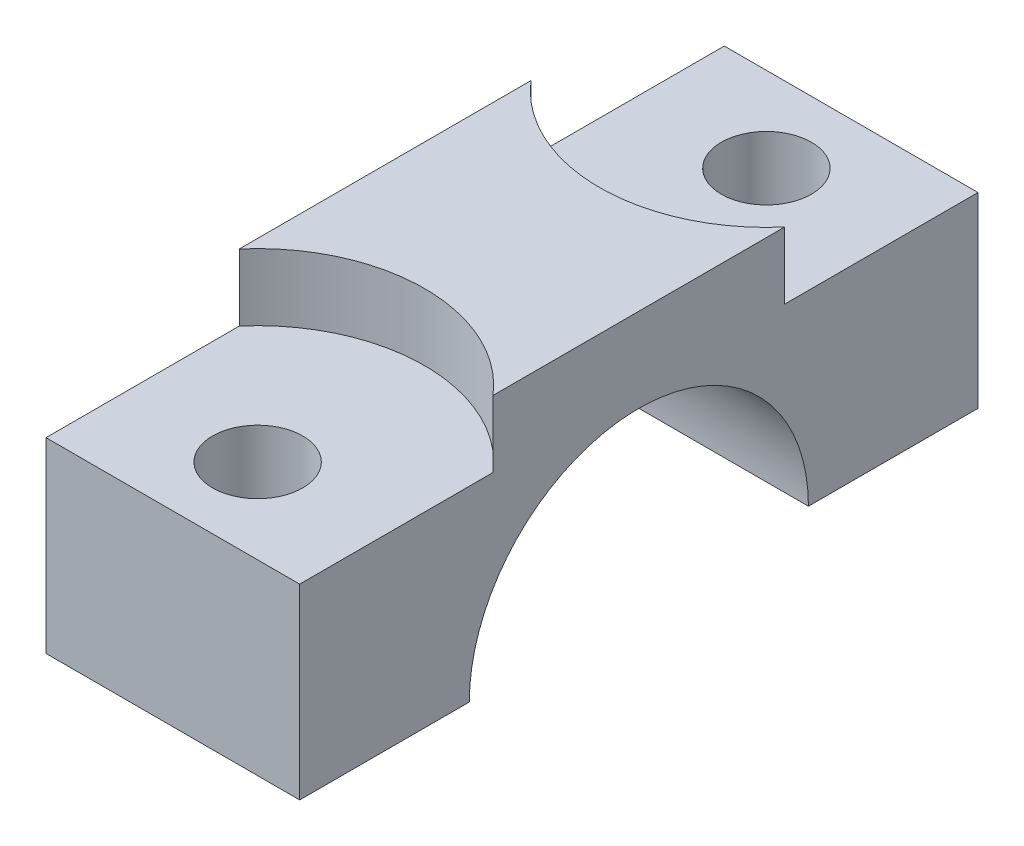
ISO-10303-21;
HEADER;
FILE_DESCRIPTION(('STEP AP214'),'2;1');
FILE_NAME('part.step','',(''),(''),'','','');
FILE_SCHEMA(('AUTOMOTIVE_DESIGN { 1 0 10303 214 1 1 1 1 }'));
ENDSEC;
DATA;
#1=APPLICATION_CONTEXT('core data for automotive mechanical design processes');
#2=APPLICATION_PROTOCOL_DEFINITION('international standard','automotive_design',2000,#1);
#3=PRODUCT_CONTEXT('',#1,'mechanical');
#4=PRODUCT('Part','Part','',(#3));
#5=PRODUCT_RELATED_PRODUCT_CATEGORY('part','',(#4));
#6=PRODUCT_DEFINITION_FORMATION('','',#4);
#7=PRODUCT_DEFINITION_CONTEXT('part definition',#1,'design');
#8=PRODUCT_DEFINITION('design','',#6,#7);
#9=PRODUCT_DEFINITION_SHAPE('','',#8);
#10=(LENGTH_UNIT() NAMED_UNIT(*) SI_UNIT(.MILLI.,.METRE.));
#11=(NAMED_UNIT(*) PLANE_ANGLE_UNIT() SI_UNIT($,.RADIAN.));
#12=(NAMED_UNIT(*) SI_UNIT($,.STERADIAN.) SOLID_ANGLE_UNIT());
#13=UNCERTAINTY_MEASURE_WITH_UNIT(LENGTH_MEASURE(1.E-05),#10,'distance_accuracy_value','');
#14=(GEOMETRIC_REPRESENTATION_CONTEXT(3) GLOBAL_UNCERTAINTY_ASSIGNED_CONTEXT((#13)) GLOBAL_UNIT_ASSIGNED_CONTEXT((#10,
#11,#12)) REPRESENTATION_CONTEXT('',''));
#15=CARTESIAN_POINT('',(0.,0.,0.));
#16=DIRECTION('',(0.,0.,1.));
#17=DIRECTION('',(1.,0.,0.));
#18=AXIS2_PLACEMENT_3D('',#15,#16,#17);
#19=CARTESIAN_POINT('',(4.93506,4.5126142470934,0.));
#20=DIRECTION('',(-1.,0.,0.));
#21=DIRECTION('',(0.,0.,1.));
#22=AXIS2_PLACEMENT_3D('',#19,#20,#21);
#23=CYLINDRICAL_SURFACE('',#22,6.597396);
#24=CARTESIAN_POINT('',(-4.93506,4.5126142470934,0.));
#25=DIRECTION('',(1.,0.,0.));
#26=DIRECTION('',(0.,0.,-1.));
#27=AXIS2_PLACEMENT_3D('',#24,#25,#26);
#28=CIRCLE('',#27,6.597396);
#29=CARTESIAN_POINT('',(-4.93506,4.5126142470934,-6.597396));
#30=VERTEX_POINT('',#29);
#31=CARTESIAN_POINT('',(-4.93506,4.5126142470934,6.597396));
#32=VERTEX_POINT('',#31);
#33=EDGE_CURVE('E152',#30,#32,#28,.T.);
#34=ORIENTED_EDGE('',*,*,#33,.F.);
#35=DIRECTION('',(-1.,0.,0.));
#36=VECTOR('',#35,1.);
#37=CARTESIAN_POINT('',(4.93506,4.5126142470934,-6.597396));
#38=LINE('',#37,#36);
#39=CARTESIAN_POINT('',(4.93506,4.5126142470934,-6.597396));
#40=VERTEX_POINT('',#39);
#41=EDGE_CURVE('E182',#40,#30,#38,.T.);
#42=ORIENTED_EDGE('',*,*,#41,.F.);
#43=CARTESIAN_POINT('',(4.93506,4.5126142470934,0.));
#44=DIRECTION('',(1.,0.,0.));
#45=DIRECTION('',(0.,0.,-1.));
#46=AXIS2_PLACEMENT_3D('',#43,#44,#45);
#47=CIRCLE('',#46,6.597396);
#48=CARTESIAN_POINT('',(4.93506,4.5126142470934,6.597396));
#49=VERTEX_POINT('',#48);
#50=EDGE_CURVE('E226',#40,#49,#47,.T.);
#51=ORIENTED_EDGE('',*,*,#50,.T.);
#52=DIRECTION('',(-1.,0.,0.));
#53=VECTOR('',#52,1.);
#54=CARTESIAN_POINT('',(4.93506,4.5126142470934,6.597396));
#55=LINE('',#54,#53);
#56=EDGE_CURVE('E172',#49,#32,#55,.T.);
#57=ORIENTED_EDGE('',*,*,#56,.T.);
#58=EDGE_LOOP('',(#34,#42,#51,#57));
#59=FACE_BOUND('',#58,.T.);
#60=ADVANCED_FACE('F40',(#59),#23,.F.);
#61=CARTESIAN_POINT('',(4.93506,4.5126142470934,0.));
#62=DIRECTION('',(0.,1.,0.));
#63=DIRECTION('',(0.,0.,1.));
#64=AXIS2_PLACEMENT_3D('',#61,#62,#63);
#65=PLANE('',#64);
#66=CARTESIAN_POINT('',(0.,4.5126142470934,-9.896094));
#67=DIRECTION('',(0.,1.,0.));
#68=DIRECTION('',(0.,0.,1.));
#69=AXIS2_PLACEMENT_3D('',#66,#67,#68);
#70=CIRCLE('',#69,1.753245);
#71=CARTESIAN_POINT('',(0.,4.5126142470934,-8.142849));
#72=VERTEX_POINT('',#71);
#73=EDGE_CURVE('E136',#72,#72,#70,.T.);
#74=ORIENTED_EDGE('',*,*,#73,.T.);
#75=EDGE_LOOP('',(#74));
#76=FACE_BOUND('',#75,.T.);
#77=DIRECTION('',(0.,0.,-1.));
#78=VECTOR('',#77,1.);
#79=CARTESIAN_POINT('',(-4.93506,4.5126142470934,0.));
#80=LINE('',#79,#78);
#81=CARTESIAN_POINT('',(-4.93506,4.51261424709341,-13.194792));
#82=VERTEX_POINT('',#81);
#83=EDGE_CURVE('E156',#30,#82,#80,.T.);
#84=ORIENTED_EDGE('',*,*,#83,.T.);
#85=DIRECTION('',(-1.,0.,0.));
#86=VECTOR('',#85,1.);
#87=CARTESIAN_POINT('',(4.93506,4.51261424709341,-13.194792));
#88=LINE('',#87,#86);
#89=CARTESIAN_POINT('',(4.93506,4.51261424709341,-13.194792));
#90=VERTEX_POINT('',#89);
#91=EDGE_CURVE('E178',#90,#82,#88,.T.);
#92=ORIENTED_EDGE('',*,*,#91,.F.);
#93=DIRECTION('',(0.,0.,-1.));
#94=VECTOR('',#93,1.);
#95=CARTESIAN_POINT('',(4.93506,4.5126142470934,0.));
#96=LINE('',#95,#94);
#97=EDGE_CURVE('E148',#40,#90,#96,.T.);
#98=ORIENTED_EDGE('',*,*,#97,.F.);
#99=ORIENTED_EDGE('',*,*,#41,.T.);
#100=EDGE_LOOP('',(#84,#92,#98,#99));
#101=FACE_BOUND('',#100,.T.);
#102=ADVANCED_FACE('F245',(#76,#101),#65,.F.);
#103=CARTESIAN_POINT('',(4.93506,4.51261424709341,-13.194792));
#104=DIRECTION('',(0.,0.,1.));
#105=DIRECTION('',(0.,-1.,0.));
#106=AXIS2_PLACEMENT_3D('',#103,#104,#105);
#107=PLANE('',#106);
#108=DIRECTION('',(0.,1.,0.));
#109=VECTOR('',#108,1.);
#110=CARTESIAN_POINT('',(-4.93506,4.51261424709341,-13.194792));
#111=LINE('',#110,#109);
#112=CARTESIAN_POINT('',(-4.93506,11.7853342470934,-13.194792));
#113=VERTEX_POINT('',#112);
#114=EDGE_CURVE('E160',#82,#113,#111,.T.);
#115=ORIENTED_EDGE('',*,*,#114,.T.);
#116=DIRECTION('',(1.,0.,0.));
#117=VECTOR('',#116,1.);
#118=CARTESIAN_POINT('',(4.93506,11.7853342470934,-13.194792));
#119=LINE('',#118,#117);
#120=CARTESIAN_POINT('',(4.93506,11.7853342470934,-13.194792));
#121=VERTEX_POINT('',#120);
#122=EDGE_CURVE('E135',#113,#121,#119,.T.);
#123=ORIENTED_EDGE('',*,*,#122,.T.);
#124=DIRECTION('',(0.,1.,0.));
#125=VECTOR('',#124,1.);
#126=CARTESIAN_POINT('',(4.93506,4.51261424709341,-13.194792));
#127=LINE('',#126,#125);
#128=EDGE_CURVE('E141',#90,#121,#127,.T.);
#129=ORIENTED_EDGE('',*,*,#128,.F.);
#130=ORIENTED_EDGE('',*,*,#91,.T.);
#131=EDGE_LOOP('',(#115,#123,#129,#130));
#132=FACE_BOUND('',#131,.T.);
#133=ADVANCED_FACE('F249',(#132),#107,.F.);
#134=CARTESIAN_POINT('',(4.93506,14.3827342470934,0.));
#135=DIRECTION('',(0.,1.,0.));
#136=DIRECTION('',(0.,0.,1.));
#137=AXIS2_PLACEMENT_3D('',#134,#135,#136);
#138=PLANE('',#137);
#139=CARTESIAN_POINT('',(0.,14.3827342470934,-9.896094));
#140=DIRECTION('',(0.,1.,0.));
#141=DIRECTION('',(0.,0.,1.));
#142=AXIS2_PLACEMENT_3D('',#139,#140,#141);
#143=CIRCLE('',#142,6.4935);
#144=CARTESIAN_POINT('',(-4.93506,14.3827342470934,-5.67581852955971));
#145=VERTEX_POINT('',#144);
#146=CARTESIAN_POINT('',(4.93506,14.3827342470934,-5.67581852955971));
#147=VERTEX_POINT('',#146);
#148=EDGE_CURVE('E115',#145,#147,#143,.T.);
#149=ORIENTED_EDGE('',*,*,#148,.F.);
#150=DIRECTION('',(0.,0.,-1.));
#151=VECTOR('',#150,1.);
#152=CARTESIAN_POINT('',(-4.93506,14.3827342470934,0.));
#153=LINE('',#152,#151);
#154=CARTESIAN_POINT('',(-4.93506,14.3827342470934,5.67581852955972));
#155=VERTEX_POINT('',#154);
#156=EDGE_CURVE('E165',#155,#145,#153,.T.);
#157=ORIENTED_EDGE('',*,*,#156,.F.);
#158=CARTESIAN_POINT('',(0.,14.3827342470934,9.896094));
#159=DIRECTION('',(0.,1.,0.));
#160=DIRECTION('',(0.,0.,1.));
#161=AXIS2_PLACEMENT_3D('',#158,#159,#160);
#162=CIRCLE('',#161,6.4935);
#163=CARTESIAN_POINT('',(4.93506,14.3827342470934,5.67581852955972));
#164=VERTEX_POINT('',#163);
#165=EDGE_CURVE('E63',#164,#155,#162,.T.);
#166=ORIENTED_EDGE('',*,*,#165,.F.);
#167=DIRECTION('',(0.,0.,-1.));
#168=VECTOR('',#167,1.);
#169=CARTESIAN_POINT('',(4.93506,14.3827342470934,0.));
#170=LINE('',#169,#168);
#171=EDGE_CURVE('E131',#164,#147,#170,.T.);
#172=ORIENTED_EDGE('',*,*,#171,.T.);
#173=EDGE_LOOP('',(#149,#157,#166,#172));
#174=FACE_BOUND('',#173,.T.);
#175=ADVANCED_FACE('F138',(#174),#138,.T.);
#176=CARTESIAN_POINT('',(4.93506,4.5126142470934,13.194792));
#177=DIRECTION('',(0.,0.,1.));
#178=DIRECTION('',(1.,0.,0.));
#179=AXIS2_PLACEMENT_3D('',#176,#177,#178);
#180=PLANE('',#179);
#181=DIRECTION('',(1.,0.,0.));
#182=VECTOR('',#181,1.);
#183=CARTESIAN_POINT('',(4.93506,11.7853342470934,13.194792));
#184=LINE('',#183,#182);
#185=CARTESIAN_POINT('',(-4.93506,11.7853342470934,13.194792));
#186=VERTEX_POINT('',#185);
#187=CARTESIAN_POINT('',(4.93506,11.7853342470934,13.194792));
#188=VERTEX_POINT('',#187);
#189=EDGE_CURVE('E221',#186,#188,#184,.T.);
#190=ORIENTED_EDGE('',*,*,#189,.F.);
#191=DIRECTION('',(0.,1.,0.));
#192=VECTOR('',#191,1.);
#193=CARTESIAN_POINT('',(-4.93506,4.5126142470934,13.194792));
#194=LINE('',#193,#192);
#195=CARTESIAN_POINT('',(-4.93506,4.5126142470934,13.194792));
#196=VERTEX_POINT('',#195);
#197=EDGE_CURVE('E168',#196,#186,#194,.T.);
#198=ORIENTED_EDGE('',*,*,#197,.F.);
#199=DIRECTION('',(-1.,0.,0.));
#200=VECTOR('',#199,1.);
#201=CARTESIAN_POINT('',(4.93506,4.5126142470934,13.194792));
#202=LINE('',#201,#200);
#203=CARTESIAN_POINT('',(4.93506,4.5126142470934,13.194792));
#204=VERTEX_POINT('',#203);
#205=EDGE_CURVE('E175',#204,#196,#202,.T.);
#206=ORIENTED_EDGE('',*,*,#205,.F.);
#207=DIRECTION('',(0.,1.,0.));
#208=VECTOR('',#207,1.);
#209=CARTESIAN_POINT('',(4.93506,4.5126142470934,13.194792));
#210=LINE('',#209,#208);
#211=EDGE_CURVE('E140',#204,#188,#210,.T.);
#212=ORIENTED_EDGE('',*,*,#211,.T.);
#213=EDGE_LOOP('',(#190,#198,#206,#212));
#214=FACE_BOUND('',#213,.T.);
#215=ADVANCED_FACE('F290',(#214),#180,.T.);
#216=CARTESIAN_POINT('',(0.,4.5126142470934,9.896094));
#217=DIRECTION('',(0.,1.,0.));
#218=DIRECTION('',(0.,0.,1.));
#219=AXIS2_PLACEMENT_3D('',#216,#217,#218);
#220=CIRCLE('',#219,1.753245);
#221=CARTESIAN_POINT('',(0.,4.5126142470934,11.649339));
#222=VERTEX_POINT('',#221);
#223=EDGE_CURVE('E210',#222,#222,#220,.T.);
#224=ORIENTED_EDGE('',*,*,#223,.T.);
#225=EDGE_LOOP('',(#224));
#226=FACE_BOUND('',#225,.T.);
#227=EDGE_CURVE('E161',#196,#32,#80,.T.);
#228=ORIENTED_EDGE('',*,*,#227,.T.);
#229=ORIENTED_EDGE('',*,*,#56,.F.);
#230=EDGE_CURVE('E146',#204,#49,#96,.T.);
#231=ORIENTED_EDGE('',*,*,#230,.F.);
#232=ORIENTED_EDGE('',*,*,#205,.T.);
#233=EDGE_LOOP('',(#228,#229,#231,#232));
#234=FACE_BOUND('',#233,.T.);
#235=ADVANCED_FACE('F239',(#226,#234),#65,.F.);
#236=CARTESIAN_POINT('',(4.93506,4.5126142470934,0.));
#237=DIRECTION('',(1.,0.,0.));
#238=DIRECTION('',(0.,0.,-1.));
#239=AXIS2_PLACEMENT_3D('',#236,#237,#238);
#240=PLANE('',#239);
#241=DIRECTION('',(0.,0.,-1.));
#242=VECTOR('',#241,1.);
#243=CARTESIAN_POINT('',(4.93506,11.7853342470934,0.));
#244=LINE('',#243,#242);
#245=CARTESIAN_POINT('',(4.93506,11.7853342470934,-5.67581852955971));
#246=VERTEX_POINT('',#245);
#247=EDGE_CURVE('E133',#246,#121,#244,.T.);
#248=ORIENTED_EDGE('',*,*,#247,.F.);
#249=DIRECTION('',(0.,1.,0.));
#250=VECTOR('',#249,1.);
#251=CARTESIAN_POINT('',(4.93506,14.3827342470934,-5.67581852955971));
#252=LINE('',#251,#250);
#253=EDGE_CURVE('E118',#147,#246,#252,.F.);
#254=ORIENTED_EDGE('',*,*,#253,.F.);
#255=ORIENTED_EDGE('',*,*,#171,.F.);
#256=DIRECTION('',(0.,1.,0.));
#257=VECTOR('',#256,1.);
#258=CARTESIAN_POINT('',(4.93506,14.3827342470934,5.67581852955972));
#259=LINE('',#258,#257);
#260=CARTESIAN_POINT('',(4.93506,11.7853342470934,5.67581852955972));
#261=VERTEX_POINT('',#260);
#262=EDGE_CURVE('E218',#261,#164,#259,.T.);
#263=ORIENTED_EDGE('',*,*,#262,.F.);
#264=DIRECTION('',(0.,0.,-1.));
#265=VECTOR('',#264,1.);
#266=CARTESIAN_POINT('',(4.93506,11.7853342470934,0.));
#267=LINE('',#266,#265);
#268=EDGE_CURVE('E157',#188,#261,#267,.T.);
#269=ORIENTED_EDGE('',*,*,#268,.F.);
#270=ORIENTED_EDGE('',*,*,#211,.F.);
#271=ORIENTED_EDGE('',*,*,#230,.T.);
#272=ORIENTED_EDGE('',*,*,#50,.F.);
#273=ORIENTED_EDGE('',*,*,#97,.T.);
#274=ORIENTED_EDGE('',*,*,#128,.T.);
#275=EDGE_LOOP('',(#248,#254,#255,#263,#269,#270,#271,#272,#273,#274));
#276=FACE_BOUND('',#275,.T.);
#277=ADVANCED_FACE('F129',(#276),#240,.T.);
#278=CARTESIAN_POINT('',(-4.93506,4.5126142470934,0.));
#279=DIRECTION('',(1.,0.,0.));
#280=DIRECTION('',(0.,0.,-1.));
#281=AXIS2_PLACEMENT_3D('',#278,#279,#280);
#282=PLANE('',#281);
#283=DIRECTION('',(0.,1.,0.));
#284=VECTOR('',#283,1.);
#285=CARTESIAN_POINT('',(-4.93506,14.3827342470934,-5.67581852955971));
#286=LINE('',#285,#284);
#287=CARTESIAN_POINT('',(-4.93506,11.7853342470934,-5.67581852955971));
#288=VERTEX_POINT('',#287);
#289=EDGE_CURVE('E48',#145,#288,#286,.F.);
#290=ORIENTED_EDGE('',*,*,#289,.T.);
#291=DIRECTION('',(0.,0.,-1.));
#292=VECTOR('',#291,1.);
#293=CARTESIAN_POINT('',(-4.93506,11.7853342470934,0.));
#294=LINE('',#293,#292);
#295=EDGE_CURVE('E11',#288,#113,#294,.T.);
#296=ORIENTED_EDGE('',*,*,#295,.T.);
#297=ORIENTED_EDGE('',*,*,#114,.F.);
#298=ORIENTED_EDGE('',*,*,#83,.F.);
#299=ORIENTED_EDGE('',*,*,#33,.T.);
#300=ORIENTED_EDGE('',*,*,#227,.F.);
#301=ORIENTED_EDGE('',*,*,#197,.T.);
#302=DIRECTION('',(0.,0.,-1.));
#303=VECTOR('',#302,1.);
#304=CARTESIAN_POINT('',(-4.93506,11.7853342470934,0.));
#305=LINE('',#304,#303);
#306=CARTESIAN_POINT('',(-4.93506,11.7853342470934,5.67581852955972));
#307=VERTEX_POINT('',#306);
#308=EDGE_CURVE('E188',#186,#307,#305,.T.);
#309=ORIENTED_EDGE('',*,*,#308,.T.);
#310=DIRECTION('',(0.,1.,0.));
#311=VECTOR('',#310,1.);
#312=CARTESIAN_POINT('',(-4.93506,14.3827342470934,5.67581852955972));
#313=LINE('',#312,#311);
#314=EDGE_CURVE('E185',#307,#155,#313,.T.);
#315=ORIENTED_EDGE('',*,*,#314,.T.);
#316=ORIENTED_EDGE('',*,*,#156,.T.);
#317=EDGE_LOOP('',(#290,#296,#297,#298,#299,#300,#301,#309,#315,#316));
#318=FACE_BOUND('',#317,.T.);
#319=ADVANCED_FACE('F193',(#318),#282,.F.);
#320=CARTESIAN_POINT('',(0.,14.3827342470934,9.896094));
#321=DIRECTION('',(0.,1.,0.));
#322=DIRECTION('',(0.,0.,1.));
#323=AXIS2_PLACEMENT_3D('',#320,#321,#322);
#324=CYLINDRICAL_SURFACE('',#323,1.753245);
#325=ORIENTED_EDGE('',*,*,#223,.F.);
#326=EDGE_LOOP('',(#325));
#327=FACE_BOUND('',#326,.T.);
#328=CARTESIAN_POINT('',(0.,11.7853342470934,9.896094));
#329=DIRECTION('',(0.,1.,0.));
#330=DIRECTION('',(0.,0.,1.));
#331=AXIS2_PLACEMENT_3D('',#328,#329,#330);
#332=CIRCLE('',#331,1.75324500000001);
#333=CARTESIAN_POINT('',(0.,11.7853342470934,11.649339));
#334=VERTEX_POINT('',#333);
#335=EDGE_CURVE('E205',#334,#334,#332,.T.);
#336=ORIENTED_EDGE('',*,*,#335,.T.);
#337=EDGE_LOOP('',(#336));
#338=FACE_BOUND('',#337,.T.);
#339=ADVANCED_FACE('F300',(#327,#338),#324,.F.);
#340=CARTESIAN_POINT('',(1.75324500000001,11.7853342470934,9.896094));
#341=DIRECTION('',(0.,-1.,0.));
#342=DIRECTION('',(0.,0.,-1.));
#343=AXIS2_PLACEMENT_3D('',#340,#341,#342);
#344=PLANE('',#343);
#345=ORIENTED_EDGE('',*,*,#268,.T.);
#346=CARTESIAN_POINT('',(0.,11.7853342470934,9.896094));
#347=DIRECTION('',(0.,1.,0.));
#348=DIRECTION('',(0.,0.,1.));
#349=AXIS2_PLACEMENT_3D('',#346,#347,#348);
#350=CIRCLE('',#349,6.4935);
#351=EDGE_CURVE('E198',#261,#307,#350,.T.);
#352=ORIENTED_EDGE('',*,*,#351,.T.);
#353=ORIENTED_EDGE('',*,*,#308,.F.);
#354=ORIENTED_EDGE('',*,*,#189,.T.);
#355=EDGE_LOOP('',(#345,#352,#353,#354));
#356=FACE_BOUND('',#355,.T.);
#357=ORIENTED_EDGE('',*,*,#335,.F.);
#358=EDGE_LOOP('',(#357));
#359=FACE_BOUND('',#358,.T.);
#360=ADVANCED_FACE('F200',(#356,#359),#344,.F.);
#361=CARTESIAN_POINT('',(0.,14.3827342470934,9.896094));
#362=DIRECTION('',(0.,1.,0.));
#363=DIRECTION('',(0.,0.,1.));
#364=AXIS2_PLACEMENT_3D('',#361,#362,#363);
#365=CYLINDRICAL_SURFACE('',#364,6.4935);
#366=ORIENTED_EDGE('',*,*,#262,.T.);
#367=ORIENTED_EDGE('',*,*,#165,.T.);
#368=ORIENTED_EDGE('',*,*,#314,.F.);
#369=ORIENTED_EDGE('',*,*,#351,.F.);
#370=EDGE_LOOP('',(#366,#367,#368,#369));
#371=FACE_BOUND('',#370,.T.);
#372=ADVANCED_FACE('F197',(#371),#365,.F.);
#373=CARTESIAN_POINT('',(0.,14.3827342470934,-9.896094));
#374=DIRECTION('',(0.,1.,0.));
#375=DIRECTION('',(0.,0.,1.));
#376=AXIS2_PLACEMENT_3D('',#373,#374,#375);
#377=CYLINDRICAL_SURFACE('',#376,1.753245);
#378=ORIENTED_EDGE('',*,*,#73,.F.);
#379=EDGE_LOOP('',(#378));
#380=FACE_BOUND('',#379,.T.);
#381=CARTESIAN_POINT('',(0.,11.7853342470934,-9.896094));
#382=DIRECTION('',(0.,1.,0.));
#383=DIRECTION('',(0.,0.,1.));
#384=AXIS2_PLACEMENT_3D('',#381,#382,#383);
#385=CIRCLE('',#384,1.75324500000001);
#386=CARTESIAN_POINT('',(0.,11.7853342470934,-8.14284899999999));
#387=VERTEX_POINT('',#386);
#388=EDGE_CURVE('E258',#387,#387,#385,.T.);
#389=ORIENTED_EDGE('',*,*,#388,.T.);
#390=EDGE_LOOP('',(#389));
#391=FACE_BOUND('',#390,.T.);
#392=ADVANCED_FACE('F266',(#380,#391),#377,.F.);
#393=CARTESIAN_POINT('',(1.75324500000001,11.7853342470934,-9.896094));
#394=DIRECTION('',(0.,-1.,0.));
#395=DIRECTION('',(0.,0.,-1.));
#396=AXIS2_PLACEMENT_3D('',#393,#394,#395);
#397=PLANE('',#396);
#398=ORIENTED_EDGE('',*,*,#247,.T.);
#399=ORIENTED_EDGE('',*,*,#122,.F.);
#400=ORIENTED_EDGE('',*,*,#295,.F.);
#401=CARTESIAN_POINT('',(0.,11.7853342470934,-9.896094));
#402=DIRECTION('',(0.,1.,0.));
#403=DIRECTION('',(0.,0.,1.));
#404=AXIS2_PLACEMENT_3D('',#401,#402,#403);
#405=CIRCLE('',#404,6.4935);
#406=EDGE_CURVE('E55',#288,#246,#405,.T.);
#407=ORIENTED_EDGE('',*,*,#406,.T.);
#408=EDGE_LOOP('',(#398,#399,#400,#407));
#409=FACE_BOUND('',#408,.T.);
#410=ORIENTED_EDGE('',*,*,#388,.F.);
#411=EDGE_LOOP('',(#410));
#412=FACE_BOUND('',#411,.T.);
#413=ADVANCED_FACE('F263',(#409,#412),#397,.F.);
#414=CARTESIAN_POINT('',(0.,14.3827342470934,-9.896094));
#415=DIRECTION('',(0.,1.,0.));
#416=DIRECTION('',(0.,0.,1.));
#417=AXIS2_PLACEMENT_3D('',#414,#415,#416);
#418=CYLINDRICAL_SURFACE('',#417,6.4935);
#419=ORIENTED_EDGE('',*,*,#253,.T.);
#420=ORIENTED_EDGE('',*,*,#406,.F.);
#421=ORIENTED_EDGE('',*,*,#289,.F.);
#422=ORIENTED_EDGE('',*,*,#148,.T.);
#423=EDGE_LOOP('',(#419,#420,#421,#422));
#424=FACE_BOUND('',#423,.T.);
#425=ADVANCED_FACE('F117',(#424),#418,.F.);
#426=CLOSED_SHELL('',(#60,#102,#133,#175,#215,#235,#277,#319,#339,#360,#372,#392,#413,#425));
#427=MANIFOLD_SOLID_BREP('B2',#426);
#428=ADVANCED_BREP_SHAPE_REPRESENTATION('',(#18,#427),#14);
#429=SHAPE_DEFINITION_REPRESENTATION(#9,#428);
ENDSEC;
END-ISO-10303-21;
